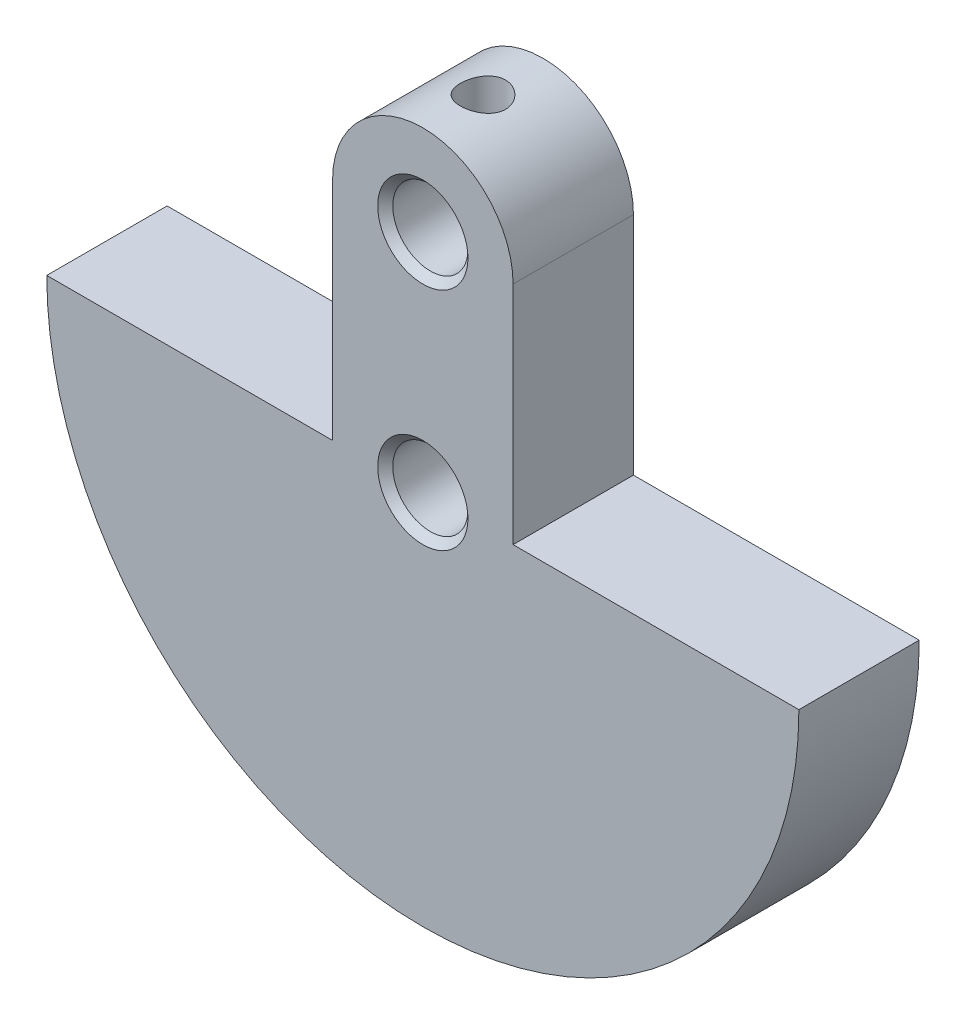
ISO-10303-21;
HEADER;
FILE_DESCRIPTION(('STEP AP214'),'2;1');
FILE_NAME('part.step','',(''),(''),'','','');
FILE_SCHEMA(('AUTOMOTIVE_DESIGN { 1 0 10303 214 1 1 1 1 }'));
ENDSEC;
DATA;
#1=APPLICATION_CONTEXT('core data for automotive mechanical design processes');
#2=APPLICATION_PROTOCOL_DEFINITION('international standard','automotive_design',2000,#1);
#3=PRODUCT_CONTEXT('',#1,'mechanical');
#4=PRODUCT('Part','Part','',(#3));
#5=PRODUCT_RELATED_PRODUCT_CATEGORY('part','',(#4));
#6=PRODUCT_DEFINITION_FORMATION('','',#4);
#7=PRODUCT_DEFINITION_CONTEXT('part definition',#1,'design');
#8=PRODUCT_DEFINITION('design','',#6,#7);
#9=PRODUCT_DEFINITION_SHAPE('','',#8);
#10=(LENGTH_UNIT() NAMED_UNIT(*) SI_UNIT(.MILLI.,.METRE.));
#11=(NAMED_UNIT(*) PLANE_ANGLE_UNIT() SI_UNIT($,.RADIAN.));
#12=(NAMED_UNIT(*) SI_UNIT($,.STERADIAN.) SOLID_ANGLE_UNIT());
#13=UNCERTAINTY_MEASURE_WITH_UNIT(LENGTH_MEASURE(1.E-05),#10,'distance_accuracy_value','');
#14=(GEOMETRIC_REPRESENTATION_CONTEXT(3) GLOBAL_UNCERTAINTY_ASSIGNED_CONTEXT((#13)) GLOBAL_UNIT_ASSIGNED_CONTEXT((#10,
#11,#12)) REPRESENTATION_CONTEXT('',''));
#15=CARTESIAN_POINT('',(0.,0.,0.));
#16=DIRECTION('',(0.,0.,1.));
#17=DIRECTION('',(1.,0.,0.));
#18=AXIS2_PLACEMENT_3D('',#15,#16,#17);
#19=CARTESIAN_POINT('',(0.,15.,8.));
#20=DIRECTION('',(0.,0.,1.));
#21=DIRECTION('',(1.,0.,0.));
#22=AXIS2_PLACEMENT_3D('',#19,#20,#21);
#23=PLANE('',#22);
#24=CARTESIAN_POINT('',(0.,15.,8.));
#25=DIRECTION('',(0.,0.,1.));
#26=DIRECTION('',(1.,0.,0.));
#27=AXIS2_PLACEMENT_3D('',#24,#25,#26);
#28=CIRCLE('',#27,3.);
#29=CARTESIAN_POINT('',(3.,15.,8.));
#30=VERTEX_POINT('',#29);
#31=EDGE_CURVE('E51',#30,#30,#28,.F.);
#32=ORIENTED_EDGE('',*,*,#31,.T.);
#33=EDGE_LOOP('',(#32));
#34=FACE_BOUND('',#33,.T.);
#35=CARTESIAN_POINT('',(0.,0.,8.));
#36=DIRECTION('',(0.,0.,1.));
#37=DIRECTION('',(1.,0.,0.));
#38=AXIS2_PLACEMENT_3D('',#35,#36,#37);
#39=CIRCLE('',#38,3.);
#40=CARTESIAN_POINT('',(3.,0.,8.));
#41=VERTEX_POINT('',#40);
#42=EDGE_CURVE('E150',#41,#41,#39,.F.);
#43=ORIENTED_EDGE('',*,*,#42,.T.);
#44=EDGE_LOOP('',(#43));
#45=FACE_BOUND('',#44,.T.);
#46=CARTESIAN_POINT('',(0.,15.,8.));
#47=DIRECTION('',(0.,0.,1.));
#48=DIRECTION('',(1.,0.,0.));
#49=AXIS2_PLACEMENT_3D('',#46,#47,#48);
#50=CIRCLE('',#49,6.);
#51=CARTESIAN_POINT('',(6.,15.,8.));
#52=VERTEX_POINT('',#51);
#53=CARTESIAN_POINT('',(-6.,15.,8.));
#54=VERTEX_POINT('',#53);
#55=EDGE_CURVE('E138',#52,#54,#50,.T.);
#56=ORIENTED_EDGE('',*,*,#55,.T.);
#57=DIRECTION('',(0.,-1.,0.));
#58=VECTOR('',#57,1.);
#59=CARTESIAN_POINT('',(-6.,15.,8.));
#60=LINE('',#59,#58);
#61=CARTESIAN_POINT('',(-6.,0.,8.));
#62=VERTEX_POINT('',#61);
#63=EDGE_CURVE('E97',#54,#62,#60,.T.);
#64=ORIENTED_EDGE('',*,*,#63,.T.);
#65=DIRECTION('',(-1.,0.,0.));
#66=VECTOR('',#65,1.);
#67=CARTESIAN_POINT('',(-6.,0.,8.));
#68=LINE('',#67,#66);
#69=CARTESIAN_POINT('',(-25.,0.,8.));
#70=VERTEX_POINT('',#69);
#71=EDGE_CURVE('E109',#62,#70,#68,.T.);
#72=ORIENTED_EDGE('',*,*,#71,.T.);
#73=CARTESIAN_POINT('',(0.,0.,8.));
#74=DIRECTION('',(0.,0.,1.));
#75=DIRECTION('',(1.,0.,0.));
#76=AXIS2_PLACEMENT_3D('',#73,#74,#75);
#77=CIRCLE('',#76,25.);
#78=CARTESIAN_POINT('',(25.,0.,8.));
#79=VERTEX_POINT('',#78);
#80=EDGE_CURVE('E104',#70,#79,#77,.T.);
#81=ORIENTED_EDGE('',*,*,#80,.T.);
#82=DIRECTION('',(-1.,0.,0.));
#83=VECTOR('',#82,1.);
#84=CARTESIAN_POINT('',(6.,0.,8.));
#85=LINE('',#84,#83);
#86=CARTESIAN_POINT('',(6.,0.,8.));
#87=VERTEX_POINT('',#86);
#88=EDGE_CURVE('E107',#79,#87,#85,.T.);
#89=ORIENTED_EDGE('',*,*,#88,.T.);
#90=DIRECTION('',(0.,1.,0.));
#91=VECTOR('',#90,1.);
#92=CARTESIAN_POINT('',(6.,15.,8.));
#93=LINE('',#92,#91);
#94=EDGE_CURVE('E59',#87,#52,#93,.T.);
#95=ORIENTED_EDGE('',*,*,#94,.T.);
#96=EDGE_LOOP('',(#56,#64,#72,#81,#89,#95));
#97=FACE_BOUND('',#96,.T.);
#98=ADVANCED_FACE('F35',(#34,#45,#97),#23,.T.);
#99=CARTESIAN_POINT('',(0.,15.,0.));
#100=DIRECTION('',(0.,0.,1.));
#101=DIRECTION('',(1.,0.,0.));
#102=AXIS2_PLACEMENT_3D('',#99,#100,#101);
#103=PLANE('',#102);
#104=CARTESIAN_POINT('',(0.,15.,0.));
#105=DIRECTION('',(0.,0.,1.));
#106=DIRECTION('',(1.,0.,0.));
#107=AXIS2_PLACEMENT_3D('',#104,#105,#106);
#108=CIRCLE('',#107,6.);
#109=CARTESIAN_POINT('',(6.,15.,0.));
#110=VERTEX_POINT('',#109);
#111=CARTESIAN_POINT('',(-6.,15.,0.));
#112=VERTEX_POINT('',#111);
#113=EDGE_CURVE('E127',#110,#112,#108,.T.);
#114=ORIENTED_EDGE('',*,*,#113,.F.);
#115=DIRECTION('',(0.,1.,0.));
#116=VECTOR('',#115,1.);
#117=CARTESIAN_POINT('',(6.,15.,0.));
#118=LINE('',#117,#116);
#119=CARTESIAN_POINT('',(6.,0.,0.));
#120=VERTEX_POINT('',#119);
#121=EDGE_CURVE('E88',#120,#110,#118,.T.);
#122=ORIENTED_EDGE('',*,*,#121,.F.);
#123=DIRECTION('',(-1.,0.,0.));
#124=VECTOR('',#123,1.);
#125=CARTESIAN_POINT('',(6.,0.,0.));
#126=LINE('',#125,#124);
#127=CARTESIAN_POINT('',(25.,0.,0.));
#128=VERTEX_POINT('',#127);
#129=EDGE_CURVE('E82',#128,#120,#126,.T.);
#130=ORIENTED_EDGE('',*,*,#129,.F.);
#131=CARTESIAN_POINT('',(0.,0.,0.));
#132=DIRECTION('',(0.,0.,1.));
#133=DIRECTION('',(1.,0.,0.));
#134=AXIS2_PLACEMENT_3D('',#131,#132,#133);
#135=CIRCLE('',#134,25.);
#136=CARTESIAN_POINT('',(-25.,0.,0.));
#137=VERTEX_POINT('',#136);
#138=EDGE_CURVE('E117',#137,#128,#135,.T.);
#139=ORIENTED_EDGE('',*,*,#138,.F.);
#140=DIRECTION('',(-1.,0.,0.));
#141=VECTOR('',#140,1.);
#142=CARTESIAN_POINT('',(-6.,0.,0.));
#143=LINE('',#142,#141);
#144=CARTESIAN_POINT('',(-6.,0.,0.));
#145=VERTEX_POINT('',#144);
#146=EDGE_CURVE('E133',#145,#137,#143,.T.);
#147=ORIENTED_EDGE('',*,*,#146,.F.);
#148=DIRECTION('',(0.,-1.,0.));
#149=VECTOR('',#148,1.);
#150=CARTESIAN_POINT('',(-6.,15.,0.));
#151=LINE('',#150,#149);
#152=EDGE_CURVE('E130',#112,#145,#151,.T.);
#153=ORIENTED_EDGE('',*,*,#152,.F.);
#154=EDGE_LOOP('',(#114,#122,#130,#139,#147,#153));
#155=FACE_BOUND('',#154,.T.);
#156=CARTESIAN_POINT('',(0.,15.,0.));
#157=DIRECTION('',(0.,0.,1.));
#158=DIRECTION('',(1.,0.,0.));
#159=AXIS2_PLACEMENT_3D('',#156,#157,#158);
#160=CIRCLE('',#159,2.5);
#161=CARTESIAN_POINT('',(2.5,15.,0.));
#162=VERTEX_POINT('',#161);
#163=EDGE_CURVE('E131',#162,#162,#160,.T.);
#164=ORIENTED_EDGE('',*,*,#163,.T.);
#165=EDGE_LOOP('',(#164));
#166=FACE_BOUND('',#165,.T.);
#167=CARTESIAN_POINT('',(0.,0.,0.));
#168=DIRECTION('',(0.,0.,1.));
#169=DIRECTION('',(1.,0.,0.));
#170=AXIS2_PLACEMENT_3D('',#167,#168,#169);
#171=CIRCLE('',#170,2.5);
#172=CARTESIAN_POINT('',(2.5,0.,0.));
#173=VERTEX_POINT('',#172);
#174=EDGE_CURVE('E172',#173,#173,#171,.T.);
#175=ORIENTED_EDGE('',*,*,#174,.T.);
#176=EDGE_LOOP('',(#175));
#177=FACE_BOUND('',#176,.T.);
#178=ADVANCED_FACE('F188',(#155,#166,#177),#103,.F.);
#179=CARTESIAN_POINT('',(0.,15.,8.));
#180=DIRECTION('',(0.,0.,-1.));
#181=DIRECTION('',(-1.,0.,0.));
#182=AXIS2_PLACEMENT_3D('',#179,#180,#181);
#183=CYLINDRICAL_SURFACE('',#182,6.);
#184=CARTESIAN_POINT('',(0.,21.,5.5));
#185=CARTESIAN_POINT('',(-0.0828760886697311,20.9999985986801,5.49999767426184));
#186=CARTESIAN_POINT('',(-0.165778157830763,20.9982657813183,5.49310844922621));
#187=CARTESIAN_POINT('',(-0.329206323770533,20.9915211382989,5.465774848693));
#188=CARTESIAN_POINT('',(-0.409731046870739,20.9865074541997,5.44532279046215));
#189=CARTESIAN_POINT('',(-0.566020872182577,20.9737562633204,5.39156074653791));
#190=CARTESIAN_POINT('',(-0.641791563430003,20.9660220284209,5.35826620128472));
#191=CARTESIAN_POINT('',(-0.786672131904427,20.9486534380759,5.27981860995517));
#192=CARTESIAN_POINT('',(-0.855781784348759,20.9390190185405,5.23466516388106));
#193=CARTESIAN_POINT('',(-0.98680192730092,20.918674135918,5.13279921034579));
#194=CARTESIAN_POINT('',(-1.04855569006107,20.9079470714853,5.07588842504082));
#195=CARTESIAN_POINT('',(-1.1617489272033,20.8867362011753,4.95254779509108));
#196=CARTESIAN_POINT('',(-1.21318723694913,20.8762524228835,4.8861168770535));
#197=CARTESIAN_POINT('',(-1.30502654279903,20.8565477569971,4.74440477326256));
#198=CARTESIAN_POINT('',(-1.34525221592536,20.847347944706,4.6690067691896));
#199=CARTESIAN_POINT('',(-1.41239690855053,20.8314949481222,4.51225158834164));
#200=CARTESIAN_POINT('',(-1.43931805543933,20.8248413567279,4.43089536667424));
#201=CARTESIAN_POINT('',(-1.47855483680429,20.8150047671755,4.26625650179753));
#202=CARTESIAN_POINT('',(-1.49115226833334,20.8117549107543,4.1830451039502));
#203=CARTESIAN_POINT('',(-1.50226177506785,20.8088936253774,4.01563143098602));
#204=CARTESIAN_POINT('',(-1.50077614181798,20.8092816044864,3.93142931930139));
#205=CARTESIAN_POINT('',(-1.48398652463928,20.8135920549662,3.76658419225552));
#206=CARTESIAN_POINT('',(-1.46901834019052,20.8174286300188,3.6859043785349));
#207=CARTESIAN_POINT('',(-1.42622418690311,20.8280670967648,3.52823894908871));
#208=CARTESIAN_POINT('',(-1.39839730206942,20.834869199707,3.45125359697102));
#209=CARTESIAN_POINT('',(-1.33038947793715,20.8507511390419,3.30226198374793));
#210=CARTESIAN_POINT('',(-1.29008666723291,20.8598532746942,3.23031382821045));
#211=CARTESIAN_POINT('',(-1.19835627601495,20.8792971084639,3.09408129024316));
#212=CARTESIAN_POINT('',(-1.14692674880884,20.8896390233474,3.02979825193274));
#213=CARTESIAN_POINT('',(-1.03266342468122,20.9107588053978,2.9087963843056));
#214=CARTESIAN_POINT('',(-0.969546258165859,20.9215406947797,2.85234550993865));
#215=CARTESIAN_POINT('',(-0.834611917503699,20.9420596557879,2.7507787575361));
#216=CARTESIAN_POINT('',(-0.762794477707943,20.9517966954942,2.70566322573643));
#217=CARTESIAN_POINT('',(-0.612115888681391,20.9691773209418,2.62794941377561));
#218=CARTESIAN_POINT('',(-0.533231393208623,20.9768136012773,2.59539465974557));
#219=CARTESIAN_POINT('',(-0.370876008142883,20.9890791699142,2.54408269429043));
#220=CARTESIAN_POINT('',(-0.287405999150485,20.9937090333928,2.52532284358186));
#221=CARTESIAN_POINT('',(-0.120539970390027,20.9993549927137,2.50254243444116));
#222=CARTESIAN_POINT('',(-0.0371967199882101,21.0004605350828,2.4981569739247));
#223=CARTESIAN_POINT('',(0.129032874801508,20.9991880481445,2.50324900205549));
#224=CARTESIAN_POINT('',(0.211919259644595,20.9968103324185,2.51272524279913));
#225=CARTESIAN_POINT('',(0.373614268776492,20.9888958112736,2.54497090839138));
#226=CARTESIAN_POINT('',(0.452465118968754,20.9834063418581,2.56754126347699));
#227=CARTESIAN_POINT('',(0.605257292452511,20.9698870663413,2.62510708402845));
#228=CARTESIAN_POINT('',(0.679198119032635,20.9618570036989,2.66010380431317));
#229=CARTESIAN_POINT('',(0.821523134429847,20.9439330792631,2.74223612887473));
#230=CARTESIAN_POINT('',(0.88978544183583,20.9340086736693,2.78957611239676));
#231=CARTESIAN_POINT('',(1.01752661364325,20.9134450918742,2.89478990879697));
#232=CARTESIAN_POINT('',(1.07700395897301,20.9028057925171,2.95266553961691));
#233=CARTESIAN_POINT('',(1.18699056807273,20.8816895696077,3.07900196084446));
#234=CARTESIAN_POINT('',(1.23724386762203,20.8712230418728,3.14768770300242));
#235=CARTESIAN_POINT('',(1.3255107590127,20.8519287837724,3.29273263446572));
#236=CARTESIAN_POINT('',(1.36352489415794,20.8431009806703,3.36909148295975));
#237=CARTESIAN_POINT('',(1.42595142060929,20.8281809473467,3.52690572241308));
#238=CARTESIAN_POINT('',(1.45044439665406,20.8220725529191,3.60832762834401));
#239=CARTESIAN_POINT('',(1.48534565995378,20.8132674409018,3.77430963788911));
#240=CARTESIAN_POINT('',(1.49575702747866,20.8105699771994,3.85886905103249));
#241=CARTESIAN_POINT('',(1.50203859033399,20.8089490120396,4.0261210238552));
#242=CARTESIAN_POINT('',(1.49831789778012,20.8099193272826,4.10879743512473));
#243=CARTESIAN_POINT('',(1.47737727831287,20.8152790900784,4.27230388866798));
#244=CARTESIAN_POINT('',(1.46015762268677,20.8196684689186,4.35313396801365));
#245=CARTESIAN_POINT('',(1.41293131944279,20.8313126068272,4.51020845906541));
#246=CARTESIAN_POINT('',(1.38300140468038,20.8385501523631,4.58647730524021));
#247=CARTESIAN_POINT('',(1.31126491360507,20.8550775572483,4.73296538271369));
#248=CARTESIAN_POINT('',(1.26945669003419,20.8643677012077,4.80318377318692));
#249=CARTESIAN_POINT('',(1.17386774863714,20.8842563426351,4.93755462900202));
#250=CARTESIAN_POINT('',(1.11980316291225,20.8948826483176,5.00150107342396));
#251=CARTESIAN_POINT('',(1.00178937118974,20.9160802724629,5.11954704479541));
#252=CARTESIAN_POINT('',(0.937837821261145,20.9266515772706,5.17364423011297));
#253=CARTESIAN_POINT('',(0.80046758670259,20.9467765564766,5.27141130856461));
#254=CARTESIAN_POINT('',(0.726898422316386,20.9563083336587,5.31487461367158));
#255=CARTESIAN_POINT('',(0.573266059510476,20.9730492497512,5.38874746294053));
#256=CARTESIAN_POINT('',(0.493207563436739,20.9802600519978,5.41916636064854));
#257=CARTESIAN_POINT('',(0.344410253243472,20.9904805956554,5.46157183032965));
#258=CARTESIAN_POINT('',(0.276380170908068,20.9940258505269,5.47595124305343));
#259=CARTESIAN_POINT('',(0.138906071536283,20.9987860523195,5.49516594362194));
#260=CARTESIAN_POINT('',(0.0694621612426162,21.0000011745089,5.5000019493053));
#261=CARTESIAN_POINT('',(0.,21.,5.5));
#262=B_SPLINE_CURVE_WITH_KNOTS('',3,(#184,#185,#186,#187,#188,#189,#190,#191,#192,#193,#194,
#195,#196,#197,#198,#199,#200,#201,#202,#203,#204,#205,#206,#207,#208,#209,#210,#211,#212,#213,
#214,#215,#216,#217,#218,#219,#220,#221,#222,#223,#224,#225,#226,#227,#228,#229,#230,#231,#232,
#233,#234,#235,#236,#237,#238,#239,#240,#241,#242,#243,#244,#245,#246,#247,#248,#249,#250,#251,
#252,#253,#254,#255,#256,#257,#258,#259,#260,#261),.UNSPECIFIED.,.T.,.F.,(4,2,2,2,2,2,2,2,2,2,2,
2,2,2,2,2,2,2,2,2,2,2,2,2,2,2,2,2,2,2,2,2,2,2,2,2,2,2,4),(0.,0.24837371247189,0.4968882377639,
0.745104902286106,0.993329940169328,1.24614435437139,1.49898729580062,1.75558647545807,
2.01214461169368,2.2635629509943,2.51494038112697,2.76022497007018,3.00552703466038,
3.25330527873879,3.50112690836163,3.75601500969019,4.01091089558247,4.26668229009114,
4.52240473688643,4.77158308949276,5.02073901112743,5.26620274514037,5.5116912732229,
5.76153587565352,6.01142363008019,6.26744509204476,6.52345518749508,6.77792254614036,
7.03233423252408,7.27943780398613,7.52653640956034,7.77216400559447,8.01782568136901,
8.2698957640991,8.52202569770418,8.77872185499588,9.0352336382135,9.24342242942149,
9.4515955604304),.UNSPECIFIED.);
#263=CARTESIAN_POINT('',(0.,21.,5.5));
#264=VERTEX_POINT('',#263);
#265=EDGE_CURVE('E175',#264,#264,#262,.T.);
#266=ORIENTED_EDGE('',*,*,#265,.T.);
#267=EDGE_LOOP('',(#266));
#268=FACE_BOUND('',#267,.T.);
#269=ORIENTED_EDGE('',*,*,#113,.T.);
#270=DIRECTION('',(0.,0.,-1.));
#271=VECTOR('',#270,1.);
#272=CARTESIAN_POINT('',(-6.,15.,8.));
#273=LINE('',#272,#271);
#274=EDGE_CURVE('E145',#54,#112,#273,.T.);
#275=ORIENTED_EDGE('',*,*,#274,.F.);
#276=ORIENTED_EDGE('',*,*,#55,.F.);
#277=DIRECTION('',(0.,0.,-1.));
#278=VECTOR('',#277,1.);
#279=CARTESIAN_POINT('',(6.,15.,8.));
#280=LINE('',#279,#278);
#281=EDGE_CURVE('E123',#52,#110,#280,.T.);
#282=ORIENTED_EDGE('',*,*,#281,.T.);
#283=EDGE_LOOP('',(#269,#275,#276,#282));
#284=FACE_BOUND('',#283,.T.);
#285=ADVANCED_FACE('F190',(#268,#284),#183,.T.);
#286=CARTESIAN_POINT('',(-6.,15.,8.));
#287=DIRECTION('',(1.,0.,0.));
#288=DIRECTION('',(0.,0.,-1.));
#289=AXIS2_PLACEMENT_3D('',#286,#287,#288);
#290=PLANE('',#289);
#291=ORIENTED_EDGE('',*,*,#152,.T.);
#292=DIRECTION('',(0.,0.,-1.));
#293=VECTOR('',#292,1.);
#294=CARTESIAN_POINT('',(-6.,0.,8.));
#295=LINE('',#294,#293);
#296=EDGE_CURVE('E142',#62,#145,#295,.T.);
#297=ORIENTED_EDGE('',*,*,#296,.F.);
#298=ORIENTED_EDGE('',*,*,#63,.F.);
#299=ORIENTED_EDGE('',*,*,#274,.T.);
#300=EDGE_LOOP('',(#291,#297,#298,#299));
#301=FACE_BOUND('',#300,.T.);
#302=ADVANCED_FACE('F182',(#301),#290,.F.);
#303=CARTESIAN_POINT('',(-6.,0.,8.));
#304=DIRECTION('',(0.,-1.,0.));
#305=DIRECTION('',(0.,0.,-1.));
#306=AXIS2_PLACEMENT_3D('',#303,#304,#305);
#307=PLANE('',#306);
#308=ORIENTED_EDGE('',*,*,#146,.T.);
#309=DIRECTION('',(0.,0.,-1.));
#310=VECTOR('',#309,1.);
#311=CARTESIAN_POINT('',(-25.,0.,8.));
#312=LINE('',#311,#310);
#313=EDGE_CURVE('E118',#70,#137,#312,.T.);
#314=ORIENTED_EDGE('',*,*,#313,.F.);
#315=ORIENTED_EDGE('',*,*,#71,.F.);
#316=ORIENTED_EDGE('',*,*,#296,.T.);
#317=EDGE_LOOP('',(#308,#314,#315,#316));
#318=FACE_BOUND('',#317,.T.);
#319=ADVANCED_FACE('F185',(#318),#307,.F.);
#320=CARTESIAN_POINT('',(0.,0.,8.));
#321=DIRECTION('',(0.,0.,-1.));
#322=DIRECTION('',(-1.,0.,0.));
#323=AXIS2_PLACEMENT_3D('',#320,#321,#322);
#324=CYLINDRICAL_SURFACE('',#323,25.);
#325=ORIENTED_EDGE('',*,*,#138,.T.);
#326=DIRECTION('',(0.,0.,-1.));
#327=VECTOR('',#326,1.);
#328=CARTESIAN_POINT('',(25.,0.,8.));
#329=LINE('',#328,#327);
#330=EDGE_CURVE('E114',#79,#128,#329,.T.);
#331=ORIENTED_EDGE('',*,*,#330,.F.);
#332=ORIENTED_EDGE('',*,*,#80,.F.);
#333=ORIENTED_EDGE('',*,*,#313,.T.);
#334=EDGE_LOOP('',(#325,#331,#332,#333));
#335=FACE_BOUND('',#334,.T.);
#336=ADVANCED_FACE('F115',(#335),#324,.T.);
#337=CARTESIAN_POINT('',(6.,0.,8.));
#338=DIRECTION('',(0.,-1.,0.));
#339=DIRECTION('',(0.,0.,-1.));
#340=AXIS2_PLACEMENT_3D('',#337,#338,#339);
#341=PLANE('',#340);
#342=ORIENTED_EDGE('',*,*,#129,.T.);
#343=DIRECTION('',(0.,0.,-1.));
#344=VECTOR('',#343,1.);
#345=CARTESIAN_POINT('',(6.,0.,8.));
#346=LINE('',#345,#344);
#347=EDGE_CURVE('E119',#87,#120,#346,.T.);
#348=ORIENTED_EDGE('',*,*,#347,.F.);
#349=ORIENTED_EDGE('',*,*,#88,.F.);
#350=ORIENTED_EDGE('',*,*,#330,.T.);
#351=EDGE_LOOP('',(#342,#348,#349,#350));
#352=FACE_BOUND('',#351,.T.);
#353=ADVANCED_FACE('F121',(#352),#341,.F.);
#354=CARTESIAN_POINT('',(6.,15.,8.));
#355=DIRECTION('',(-1.,0.,0.));
#356=DIRECTION('',(0.,0.,1.));
#357=AXIS2_PLACEMENT_3D('',#354,#355,#356);
#358=PLANE('',#357);
#359=ORIENTED_EDGE('',*,*,#121,.T.);
#360=ORIENTED_EDGE('',*,*,#281,.F.);
#361=ORIENTED_EDGE('',*,*,#94,.F.);
#362=ORIENTED_EDGE('',*,*,#347,.T.);
#363=EDGE_LOOP('',(#359,#360,#361,#362));
#364=FACE_BOUND('',#363,.T.);
#365=ADVANCED_FACE('F167',(#364),#358,.F.);
#366=CARTESIAN_POINT('',(0.,15.,8.));
#367=DIRECTION('',(0.,0.,-1.));
#368=DIRECTION('',(-1.,0.,0.));
#369=AXIS2_PLACEMENT_3D('',#366,#367,#368);
#370=CYLINDRICAL_SURFACE('',#369,2.5);
#371=CARTESIAN_POINT('',(0.,17.5,5.5));
#372=CARTESIAN_POINT('',(-0.0767298334620159,17.4999962578973,5.49999590899012));
#373=CARTESIAN_POINT('',(-0.153582320644178,17.4964290461501,5.49407132907374));
#374=CARTESIAN_POINT('',(-0.304975509530679,17.4824990360857,5.47067568048467));
#375=CARTESIAN_POINT('',(-0.379510034596047,17.4721194803272,5.45317613814577));
#376=CARTESIAN_POINT('',(-0.523751827790836,17.4456155805449,5.40761363883314));
#377=CARTESIAN_POINT('',(-0.593481028226566,17.4295197327294,5.37960304183684));
#378=CARTESIAN_POINT('',(-0.727030318214659,17.3929536762641,5.31413966685897));
#379=CARTESIAN_POINT('',(-0.790851869416383,17.3724845538025,5.27668923303125));
#380=CARTESIAN_POINT('',(-0.916299278999315,17.3270536071909,5.19022517329142));
#381=CARTESIAN_POINT('',(-0.977384020081415,17.3018679219598,5.14054630464861));
#382=CARTESIAN_POINT('',(-1.09088270411891,17.2503043927963,5.03253279617173));
#383=CARTESIAN_POINT('',(-1.14328534948112,17.2239250515357,4.97418706281268));
#384=CARTESIAN_POINT('',(-1.24444996762974,17.1691106699591,4.84207648950327));
#385=CARTESIAN_POINT('',(-1.29197766378809,17.1408201770365,4.76729822901871));
#386=CARTESIAN_POINT('',(-1.37361437764896,17.0893830141212,4.60915342675688));
#387=CARTESIAN_POINT('',(-1.4077451733516,17.0662280227394,4.52580110375243));
#388=CARTESIAN_POINT('',(-1.45440601714222,17.0335462966093,4.37340354934676));
#389=CARTESIAN_POINT('',(-1.47016197246826,17.0220788313759,4.30576400138968));
#390=CARTESIAN_POINT('',(-1.49216172340475,17.005903082955,4.16819628416964));
#391=CARTESIAN_POINT('',(-1.49841734556836,17.0011863964376,4.09827107124551));
#392=CARTESIAN_POINT('',(-1.50105508796009,16.9992092246386,3.95798850578266));
#393=CARTESIAN_POINT('',(-1.49741783408419,17.0019633701272,3.8876305749068));
#394=CARTESIAN_POINT('',(-1.48046060478828,17.0145326144374,3.74872122457241));
#395=CARTESIAN_POINT('',(-1.46713334620103,17.0243530243223,3.68017120415256));
#396=CARTESIAN_POINT('',(-1.43173921881792,17.0495318694426,3.54746975787189));
#397=CARTESIAN_POINT('',(-1.40978748666087,17.0648171165254,3.48327294607552));
#398=CARTESIAN_POINT('',(-1.35795061770837,17.0992705135083,3.35930500907188));
#399=CARTESIAN_POINT('',(-1.32806257259705,17.1184400862346,3.29953551657607));
#400=CARTESIAN_POINT('',(-1.25517983184583,17.1625532726899,3.1750159028772));
#401=CARTESIAN_POINT('',(-1.21080724397723,17.1879204337299,3.11122190704507));
#402=CARTESIAN_POINT('',(-1.11291092784003,17.2393059976438,2.99132351633298));
#403=CARTESIAN_POINT('',(-1.05937845100578,17.2653250026215,2.93522656602349));
#404=CARTESIAN_POINT('',(-0.935811834382966,17.3193550495832,2.82438701817824));
#405=CARTESIAN_POINT('',(-0.864517682704956,17.3471383626853,2.77092269398401));
#406=CARTESIAN_POINT('',(-0.712276050458999,17.3977242843398,2.67687795280209));
#407=CARTESIAN_POINT('',(-0.631333763943563,17.4205295542552,2.63629064621005));
#408=CARTESIAN_POINT('',(-0.467197585268205,17.4573039206615,2.5720678172041));
#409=CARTESIAN_POINT('',(-0.384467624173579,17.471739574397,2.54752464428409));
#410=CARTESIAN_POINT('',(-0.215047895144638,17.4921884281355,2.51298880259462));
#411=CARTESIAN_POINT('',(-0.128363005661317,17.4982117295274,2.50297868224642));
#412=CARTESIAN_POINT('',(0.0337146143773981,17.5009057037461,2.49849215232169));
#413=CARTESIAN_POINT('',(0.109042473418719,17.4987352171429,2.50209114491483));
#414=CARTESIAN_POINT('',(0.257829401986062,17.4877871208705,2.52042585307192));
#415=CARTESIAN_POINT('',(0.331288509376107,17.4790096451804,2.53516134280581));
#416=CARTESIAN_POINT('',(0.472574932157614,17.4559479244219,2.57454343281246));
#417=CARTESIAN_POINT('',(0.540495750928485,17.4418027566255,2.59894034907347));
#418=CARTESIAN_POINT('',(0.671265749087264,17.4091388086284,2.65667737636527));
#419=CARTESIAN_POINT('',(0.73411392496391,17.3906191658651,2.69001925134667));
#420=CARTESIAN_POINT('',(0.860006262823866,17.3484549623736,2.76855697920871));
#421=CARTESIAN_POINT('',(0.922394150456839,17.3244780273988,2.8146238290784));
#422=CARTESIAN_POINT('',(1.03902603131014,17.2747426557473,2.91539139348862));
#423=CARTESIAN_POINT('',(1.09326040273738,17.2489821658636,2.97010215485254));
#424=CARTESIAN_POINT('',(1.19931996735579,17.1944542390989,3.09491039003715));
#425=CARTESIAN_POINT('',(1.24991019630915,17.1657324174629,3.16608388546551));
#426=CARTESIAN_POINT('',(1.33845238915668,17.1121618206671,3.31721602456821));
#427=CARTESIAN_POINT('',(1.37641766769781,17.0873089799769,3.39716529389279));
#428=CARTESIAN_POINT('',(1.43142578795776,17.0498490924052,3.54624302230669));
#429=CARTESIAN_POINT('',(1.4512162533619,17.0357565932873,3.61398031235859));
#430=CARTESIAN_POINT('',(1.48113663905972,17.0140960574354,3.75253207808011));
#431=CARTESIAN_POINT('',(1.49127995297631,17.0065189764272,3.82334214432783));
#432=CARTESIAN_POINT('',(1.50134130416631,16.9990044661627,3.96637694759703));
#433=CARTESIAN_POINT('',(1.50122089107869,16.9990957644594,4.03860599068704));
#434=CARTESIAN_POINT('',(1.49066472959328,17.0069771789285,4.18189443560946));
#435=CARTESIAN_POINT('',(1.48022337215759,17.0147714813882,4.2529531800806));
#436=CARTESIAN_POINT('',(1.45040174148913,17.0363318524298,4.38848841757219));
#437=CARTESIAN_POINT('',(1.43147636845351,17.0497921180558,4.45311709430687));
#438=CARTESIAN_POINT('',(1.38563242076993,17.0810550196015,4.57833725447422));
#439=CARTESIAN_POINT('',(1.35871083588479,17.0988592904048,4.63892720696056));
#440=CARTESIAN_POINT('',(1.29289245555732,17.1401299055092,4.76431985722078));
#441=CARTESIAN_POINT('',(1.25279167675753,17.1640458758264,4.82834110385431));
#442=CARTESIAN_POINT('',(1.16375698389084,17.2132012703077,4.94938007261729));
#443=CARTESIAN_POINT('',(1.11481579607798,17.2384417720502,5.00639196215256));
#444=CARTESIAN_POINT('',(1.00009777425734,17.2922569029148,5.12135094913167));
#445=CARTESIAN_POINT('',(0.932876819313901,17.3207030866366,5.17793107489619));
#446=CARTESIAN_POINT('',(0.788462434445585,17.3736542887237,5.27909785586331));
#447=CARTESIAN_POINT('',(0.711265444501536,17.3981578931094,5.3236802119848));
#448=CARTESIAN_POINT('',(0.55112523080145,17.4398557865439,5.39778580757374));
#449=CARTESIAN_POINT('',(0.46843008695721,17.4572507747979,5.42772806492683));
#450=CARTESIAN_POINT('',(0.297973306118803,17.4836627300125,5.47272469521098));
#451=CARTESIAN_POINT('',(0.210232099648608,17.4927112587148,5.48783516785699));
#452=CARTESIAN_POINT('',(0.101558096917533,17.4980200116819,5.49669745470866));
#453=CARTESIAN_POINT('',(0.0812762590282742,17.4987611465636,5.4979344173061));
#454=CARTESIAN_POINT('',(0.0406658206871104,17.4997516451737,5.49958624637086));
#455=CARTESIAN_POINT('',(0.0203372186375685,17.5000009918432,5.5000010843209));
#456=CARTESIAN_POINT('',(0.,17.5,5.5));
#457=B_SPLINE_CURVE_WITH_KNOTS('',3,(#371,#372,#373,#374,#375,#376,#377,#378,#379,#380,#381,
#382,#383,#384,#385,#386,#387,#388,#389,#390,#391,#392,#393,#394,#395,#396,#397,#398,#399,#400,
#401,#402,#403,#404,#405,#406,#407,#408,#409,#410,#411,#412,#413,#414,#415,#416,#417,#418,#419,
#420,#421,#422,#423,#424,#425,#426,#427,#428,#429,#430,#431,#432,#433,#434,#435,#436,#437,#438,
#439,#440,#441,#442,#443,#444,#445,#446,#447,#448,#449,#450,#451,#452,#453,#454,#455,#456),
.UNSPECIFIED.,.T.,.F.,(4,2,2,2,2,2,2,2,2,2,2,2,2,2,2,2,2,2,2,2,2,2,2,2,2,2,2,2,2,2,2,2,2,2,2,2,
2,2,2,2,2,2,4),(0.,0.230102237548649,0.460772627520012,0.690308884600012,0.919788197992275,
1.16681590732472,1.41416257934801,1.69183813189807,1.96906040692092,2.17933829855633,
2.38935420916578,2.59978170870726,2.81036753273872,3.01823267593207,3.22617409809868,
3.47046995225163,3.71500044803674,3.99360957884691,4.27206939275324,4.53296790696559,
4.79355286918236,5.01875602722426,5.24395461863455,5.46367785689772,5.68344445659025,
5.92601365818362,6.16886690081836,6.44336762428009,6.71757792616456,6.93257787314692,
7.14727888733319,7.36278425777433,7.57840681155725,7.78364098331142,7.98895251523035,
8.22578610052286,8.46281544370208,8.73854311775519,9.01436946031985,9.28175654462677,
9.54812832184448,9.60911473335177,9.6701032602764),.UNSPECIFIED.);
#458=CARTESIAN_POINT('',(0.,17.5,5.5));
#459=VERTEX_POINT('',#458);
#460=EDGE_CURVE('E40',#459,#459,#457,.T.);
#461=ORIENTED_EDGE('',*,*,#460,.F.);
#462=EDGE_LOOP('',(#461));
#463=FACE_BOUND('',#462,.T.);
#464=CARTESIAN_POINT('',(0.,15.,7.5));
#465=DIRECTION('',(0.,0.,1.));
#466=DIRECTION('',(1.,0.,0.));
#467=AXIS2_PLACEMENT_3D('',#464,#465,#466);
#468=CIRCLE('',#467,2.5);
#469=CARTESIAN_POINT('',(2.5,15.,7.5));
#470=VERTEX_POINT('',#469);
#471=EDGE_CURVE('E147',#470,#470,#468,.T.);
#472=ORIENTED_EDGE('',*,*,#471,.T.);
#473=EDGE_LOOP('',(#472));
#474=FACE_BOUND('',#473,.T.);
#475=ORIENTED_EDGE('',*,*,#163,.F.);
#476=EDGE_LOOP('',(#475));
#477=FACE_BOUND('',#476,.T.);
#478=ADVANCED_FACE('F164',(#463,#474,#477),#370,.F.);
#479=CARTESIAN_POINT('',(0.,0.,8.));
#480=DIRECTION('',(0.,0.,-1.));
#481=DIRECTION('',(-1.,0.,0.));
#482=AXIS2_PLACEMENT_3D('',#479,#480,#481);
#483=CYLINDRICAL_SURFACE('',#482,2.5);
#484=CARTESIAN_POINT('',(0.,0.,7.5));
#485=DIRECTION('',(0.,0.,1.));
#486=DIRECTION('',(1.,0.,0.));
#487=AXIS2_PLACEMENT_3D('',#484,#485,#486);
#488=CIRCLE('',#487,2.5);
#489=CARTESIAN_POINT('',(2.5,0.,7.5));
#490=VERTEX_POINT('',#489);
#491=EDGE_CURVE('E11',#490,#490,#488,.T.);
#492=ORIENTED_EDGE('',*,*,#491,.T.);
#493=EDGE_LOOP('',(#492));
#494=FACE_BOUND('',#493,.T.);
#495=ORIENTED_EDGE('',*,*,#174,.F.);
#496=EDGE_LOOP('',(#495));
#497=FACE_BOUND('',#496,.T.);
#498=ADVANCED_FACE('F161',(#494,#497),#483,.F.);
#499=CARTESIAN_POINT('',(0.,15.,7.5));
#500=DIRECTION('',(0.,0.,1.));
#501=DIRECTION('',(1.,0.,0.));
#502=AXIS2_PLACEMENT_3D('',#499,#500,#501);
#503=CONICAL_SURFACE('',#502,2.5,0.785398163397447);
#504=ORIENTED_EDGE('',*,*,#31,.F.);
#505=EDGE_LOOP('',(#504));
#506=FACE_BOUND('',#505,.T.);
#507=ORIENTED_EDGE('',*,*,#471,.F.);
#508=EDGE_LOOP('',(#507));
#509=FACE_BOUND('',#508,.T.);
#510=ADVANCED_FACE('F158',(#506,#509),#503,.F.);
#511=CARTESIAN_POINT('',(0.,0.,7.5));
#512=DIRECTION('',(0.,0.,1.));
#513=DIRECTION('',(1.,0.,0.));
#514=AXIS2_PLACEMENT_3D('',#511,#512,#513);
#515=CONICAL_SURFACE('',#514,2.5,0.785398163397447);
#516=ORIENTED_EDGE('',*,*,#42,.F.);
#517=EDGE_LOOP('',(#516));
#518=FACE_BOUND('',#517,.T.);
#519=ORIENTED_EDGE('',*,*,#491,.F.);
#520=EDGE_LOOP('',(#519));
#521=FACE_BOUND('',#520,.T.);
#522=ADVANCED_FACE('F38',(#518,#521),#515,.F.);
#523=CARTESIAN_POINT('',(0.,16.,4.));
#524=DIRECTION('',(0.,1.,0.));
#525=DIRECTION('',(0.,0.,1.));
#526=AXIS2_PLACEMENT_3D('',#523,#524,#525);
#527=CYLINDRICAL_SURFACE('',#526,1.5);
#528=ORIENTED_EDGE('',*,*,#460,.T.);
#529=EDGE_LOOP('',(#528));
#530=FACE_BOUND('',#529,.T.);
#531=ORIENTED_EDGE('',*,*,#265,.F.);
#532=EDGE_LOOP('',(#531));
#533=FACE_BOUND('',#532,.T.);
#534=ADVANCED_FACE('F207',(#530,#533),#527,.F.);
#535=CLOSED_SHELL('',(#98,#178,#285,#302,#319,#336,#353,#365,#478,#498,#510,#522,#534));
#536=MANIFOLD_SOLID_BREP('B2',#535);
#537=ADVANCED_BREP_SHAPE_REPRESENTATION('',(#18,#536),#14);
#538=SHAPE_DEFINITION_REPRESENTATION(#9,#537);
ENDSEC;
END-ISO-10303-21;
